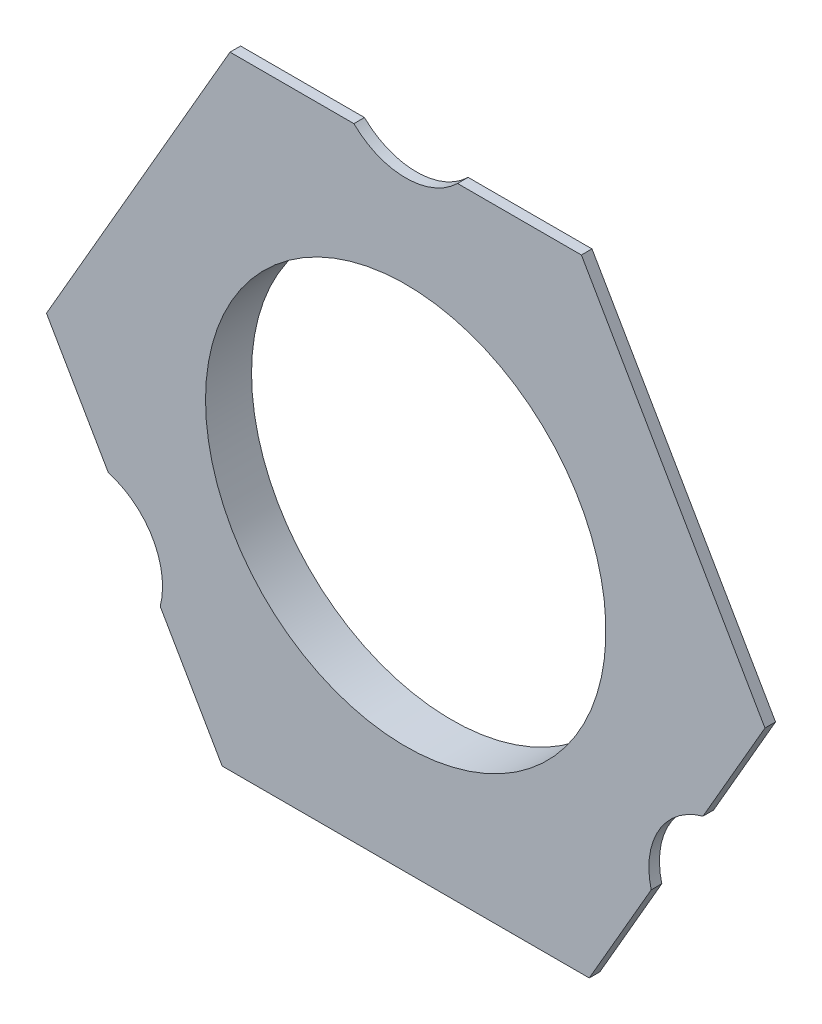
ISO-10303-21;
HEADER;
FILE_DESCRIPTION(('STEP AP214'),'2;1');
FILE_NAME('part.step','',(''),(''),'','','');
FILE_SCHEMA(('AUTOMOTIVE_DESIGN { 1 0 10303 214 1 1 1 1 }'));
ENDSEC;
DATA;
#1=APPLICATION_CONTEXT('core data for automotive mechanical design processes');
#2=APPLICATION_PROTOCOL_DEFINITION('international standard','automotive_design',2000,#1);
#3=PRODUCT_CONTEXT('',#1,'mechanical');
#4=PRODUCT('Part','Part','',(#3));
#5=PRODUCT_RELATED_PRODUCT_CATEGORY('part','',(#4));
#6=PRODUCT_DEFINITION_FORMATION('','',#4);
#7=PRODUCT_DEFINITION_CONTEXT('part definition',#1,'design');
#8=PRODUCT_DEFINITION('design','',#6,#7);
#9=PRODUCT_DEFINITION_SHAPE('','',#8);
#10=(LENGTH_UNIT() NAMED_UNIT(*) SI_UNIT(.MILLI.,.METRE.));
#11=(NAMED_UNIT(*) PLANE_ANGLE_UNIT() SI_UNIT($,.RADIAN.));
#12=(NAMED_UNIT(*) SI_UNIT($,.STERADIAN.) SOLID_ANGLE_UNIT());
#13=UNCERTAINTY_MEASURE_WITH_UNIT(LENGTH_MEASURE(1.E-05),#10,'distance_accuracy_value','');
#14=(GEOMETRIC_REPRESENTATION_CONTEXT(3) GLOBAL_UNCERTAINTY_ASSIGNED_CONTEXT((#13)) GLOBAL_UNIT_ASSIGNED_CONTEXT((#10,
#11,#12)) REPRESENTATION_CONTEXT('',''));
#15=CARTESIAN_POINT('',(0.,0.,0.));
#16=DIRECTION('',(0.,0.,1.));
#17=DIRECTION('',(1.,0.,0.));
#18=AXIS2_PLACEMENT_3D('',#15,#16,#17);
#19=CARTESIAN_POINT('',(39.85,0.,0.));
#20=DIRECTION('',(0.,0.,1.));
#21=DIRECTION('',(1.,0.,0.));
#22=AXIS2_PLACEMENT_3D('',#19,#20,#21);
#23=PLANE('',#22);
#24=CARTESIAN_POINT('',(0.,0.,0.));
#25=DIRECTION('',(0.,0.,1.));
#26=DIRECTION('',(1.,0.,0.));
#27=AXIS2_PLACEMENT_3D('',#24,#25,#26);
#28=CIRCLE('',#27,39.6);
#29=CARTESIAN_POINT('',(39.6,0.,0.));
#30=VERTEX_POINT('',#29);
#31=EDGE_CURVE('E44',#30,#30,#28,.F.);
#32=ORIENTED_EDGE('',*,*,#31,.T.);
#33=EDGE_LOOP('',(#32));
#34=FACE_BOUND('',#33,.T.);
#35=CARTESIAN_POINT('',(0.,0.,0.));
#36=DIRECTION('',(0.,0.,-1.));
#37=DIRECTION('',(-1.,0.,0.));
#38=AXIS2_PLACEMENT_3D('',#35,#36,#37);
#39=CIRCLE('',#38,37.85);
#40=CARTESIAN_POINT('',(-37.85,0.,0.));
#41=VERTEX_POINT('',#40);
#42=EDGE_CURVE('E211',#41,#41,#39,.T.);
#43=ORIENTED_EDGE('',*,*,#42,.F.);
#44=EDGE_LOOP('',(#43));
#45=FACE_BOUND('',#44,.T.);
#46=ADVANCED_FACE('F35',(#34,#45),#23,.F.);
#47=CARTESIAN_POINT('',(0.,0.,-73.9813673678491));
#48=DIRECTION('',(0.,0.,-1.));
#49=DIRECTION('',(-1.,0.,0.));
#50=AXIS2_PLACEMENT_3D('',#47,#48,#49);
#51=CYLINDRICAL_SURFACE('',#50,37.85);
#52=CARTESIAN_POINT('',(0.,0.,8.7));
#53=DIRECTION('',(0.,0.,-1.));
#54=DIRECTION('',(-1.,0.,0.));
#55=AXIS2_PLACEMENT_3D('',#52,#53,#54);
#56=CIRCLE('',#55,37.85);
#57=CARTESIAN_POINT('',(-37.85,0.,8.7));
#58=VERTEX_POINT('',#57);
#59=EDGE_CURVE('E161',#58,#58,#56,.F.);
#60=ORIENTED_EDGE('',*,*,#59,.T.);
#61=EDGE_LOOP('',(#60));
#62=FACE_BOUND('',#61,.T.);
#63=ORIENTED_EDGE('',*,*,#42,.T.);
#64=EDGE_LOOP('',(#63));
#65=FACE_BOUND('',#64,.T.);
#66=ADVANCED_FACE('F229',(#62,#65),#51,.F.);
#67=CARTESIAN_POINT('',(44.5,0.,8.7));
#68=DIRECTION('',(0.,0.,-1.));
#69=DIRECTION('',(-1.,0.,0.));
#70=AXIS2_PLACEMENT_3D('',#67,#68,#69);
#71=PLANE('',#70);
#72=DIRECTION('',(-0.5,0.866025403784439,0.));
#73=VECTOR('',#72,1.);
#74=CARTESIAN_POINT('',(67.9209846597947,-0.857403669130516,8.7));
#75=LINE('',#74,#73);
#76=CARTESIAN_POINT('',(67.9209846597947,-0.857403669130516,8.7));
#77=VERTEX_POINT('',#76);
#78=CARTESIAN_POINT('',(33.2179589711327,59.25,8.7));
#79=VERTEX_POINT('',#78);
#80=EDGE_CURVE('E93',#77,#79,#75,.T.);
#81=ORIENTED_EDGE('',*,*,#80,.T.);
#82=DIRECTION('',(-1.,0.,0.));
#83=VECTOR('',#82,1.);
#84=CARTESIAN_POINT('',(9.79795897113271,59.25,8.7));
#85=LINE('',#84,#83);
#86=CARTESIAN_POINT('',(9.79795897113271,59.25,8.7));
#87=VERTEX_POINT('',#86);
#88=EDGE_CURVE('E184',#79,#87,#85,.T.);
#89=ORIENTED_EDGE('',*,*,#88,.T.);
#90=CARTESIAN_POINT('',(0.,69.25,8.7));
#91=DIRECTION('',(0.,0.,-1.));
#92=DIRECTION('',(1.,0.,0.));
#93=AXIS2_PLACEMENT_3D('',#90,#91,#92);
#94=CIRCLE('',#93,14.);
#95=CARTESIAN_POINT('',(-9.79795897113271,59.25,8.7));
#96=VERTEX_POINT('',#95);
#97=EDGE_CURVE('E99',#87,#96,#94,.T.);
#98=ORIENTED_EDGE('',*,*,#97,.T.);
#99=DIRECTION('',(-1.,0.,0.));
#100=VECTOR('',#99,1.);
#101=CARTESIAN_POINT('',(-9.79795897113271,59.25,8.7));
#102=LINE('',#101,#100);
#103=CARTESIAN_POINT('',(-33.2179589711327,59.25,8.7));
#104=VERTEX_POINT('',#103);
#105=EDGE_CURVE('E160',#96,#104,#102,.T.);
#106=ORIENTED_EDGE('',*,*,#105,.T.);
#107=DIRECTION('',(-0.5,-0.866025403784439,0.));
#108=VECTOR('',#107,1.);
#109=CARTESIAN_POINT('',(-33.2179589711327,59.25,8.7));
#110=LINE('',#109,#108);
#111=CARTESIAN_POINT('',(-67.9209846597947,-0.857403669130529,8.7));
#112=VERTEX_POINT('',#111);
#113=EDGE_CURVE('E164',#104,#112,#110,.T.);
#114=ORIENTED_EDGE('',*,*,#113,.T.);
#115=DIRECTION('',(0.499999999999999,-0.866025403784439,0.));
#116=VECTOR('',#115,1.);
#117=CARTESIAN_POINT('',(-56.2109846597947,-21.1397186257621,8.7));
#118=LINE('',#117,#116);
#119=CARTESIAN_POINT('',(-56.2109846597947,-21.1397186257621,8.7));
#120=VERTEX_POINT('',#119);
#121=EDGE_CURVE('E166',#112,#120,#118,.T.);
#122=ORIENTED_EDGE('',*,*,#121,.T.);
#123=CARTESIAN_POINT('',(-59.9722592120727,-34.6250000000007,8.7));
#124=DIRECTION('',(0.,0.,-1.));
#125=DIRECTION('',(1.,0.,0.));
#126=AXIS2_PLACEMENT_3D('',#123,#124,#125);
#127=CIRCLE('',#126,14.);
#128=CARTESIAN_POINT('',(-46.413025688662,-38.1102813742392,8.7));
#129=VERTEX_POINT('',#128);
#130=EDGE_CURVE('E168',#120,#129,#127,.T.);
#131=ORIENTED_EDGE('',*,*,#130,.T.);
#132=DIRECTION('',(0.5,-0.866025403784438,0.));
#133=VECTOR('',#132,1.);
#134=CARTESIAN_POINT('',(-46.413025688662,-38.1102813742392,8.7));
#135=LINE('',#134,#133);
#136=CARTESIAN_POINT('',(-34.703025688662,-58.3925963308708,8.7));
#137=VERTEX_POINT('',#136);
#138=EDGE_CURVE('E170',#129,#137,#135,.T.);
#139=ORIENTED_EDGE('',*,*,#138,.T.);
#140=DIRECTION('',(1.,0.,0.));
#141=VECTOR('',#140,1.);
#142=CARTESIAN_POINT('',(-34.703025688662,-58.3925963308708,8.7));
#143=LINE('',#142,#141);
#144=CARTESIAN_POINT('',(34.703025688662,-58.3925963308708,8.7));
#145=VERTEX_POINT('',#144);
#146=EDGE_CURVE('E173',#137,#145,#143,.T.);
#147=ORIENTED_EDGE('',*,*,#146,.T.);
#148=DIRECTION('',(0.5,0.866025403784439,0.));
#149=VECTOR('',#148,1.);
#150=CARTESIAN_POINT('',(46.413025688662,-38.1102813742392,8.7));
#151=LINE('',#150,#149);
#152=CARTESIAN_POINT('',(46.413025688662,-38.1102813742392,8.7));
#153=VERTEX_POINT('',#152);
#154=EDGE_CURVE('E176',#145,#153,#151,.T.);
#155=ORIENTED_EDGE('',*,*,#154,.T.);
#156=CARTESIAN_POINT('',(59.9722592120728,-34.6250000000006,8.7));
#157=DIRECTION('',(0.,0.,-1.));
#158=DIRECTION('',(1.,0.,0.));
#159=AXIS2_PLACEMENT_3D('',#156,#157,#158);
#160=CIRCLE('',#159,14.);
#161=CARTESIAN_POINT('',(56.2109846597947,-21.1397186257621,8.7));
#162=VERTEX_POINT('',#161);
#163=EDGE_CURVE('E179',#153,#162,#160,.T.);
#164=ORIENTED_EDGE('',*,*,#163,.T.);
#165=DIRECTION('',(0.5,0.866025403784439,0.));
#166=VECTOR('',#165,1.);
#167=CARTESIAN_POINT('',(56.2109846597947,-21.1397186257621,8.7));
#168=LINE('',#167,#166);
#169=EDGE_CURVE('E181',#162,#77,#168,.T.);
#170=ORIENTED_EDGE('',*,*,#169,.T.);
#171=EDGE_LOOP('',(#81,#89,#98,#106,#114,#122,#131,#139,#147,#155,#164,#170));
#172=FACE_BOUND('',#171,.T.);
#173=ORIENTED_EDGE('',*,*,#59,.F.);
#174=EDGE_LOOP('',(#173));
#175=FACE_BOUND('',#174,.T.);
#176=ADVANCED_FACE('F233',(#172,#175),#71,.F.);
#177=CARTESIAN_POINT('',(55.25,0.,6.70000000000001));
#178=DIRECTION('',(0.,0.,1.));
#179=DIRECTION('',(1.,0.,0.));
#180=AXIS2_PLACEMENT_3D('',#177,#178,#179);
#181=PLANE('',#180);
#182=CARTESIAN_POINT('',(-59.9722592120727,-34.6250000000007,6.7));
#183=DIRECTION('',(0.,0.,-1.));
#184=DIRECTION('',(1.,0.,0.));
#185=AXIS2_PLACEMENT_3D('',#182,#183,#184);
#186=CIRCLE('',#185,14.);
#187=CARTESIAN_POINT('',(-56.2109846597947,-21.1397186257621,6.7));
#188=VERTEX_POINT('',#187);
#189=CARTESIAN_POINT('',(-46.413025688662,-38.1102813742392,6.7));
#190=VERTEX_POINT('',#189);
#191=EDGE_CURVE('E300',#188,#190,#186,.T.);
#192=ORIENTED_EDGE('',*,*,#191,.F.);
#193=DIRECTION('',(0.499999999999999,-0.866025403784439,0.));
#194=VECTOR('',#193,1.);
#195=CARTESIAN_POINT('',(-56.2109846597947,-21.1397186257621,6.7));
#196=LINE('',#195,#194);
#197=CARTESIAN_POINT('',(-67.9209846597947,-0.857403669130529,6.7));
#198=VERTEX_POINT('',#197);
#199=EDGE_CURVE('E297',#198,#188,#196,.T.);
#200=ORIENTED_EDGE('',*,*,#199,.F.);
#201=DIRECTION('',(-0.5,-0.866025403784439,0.));
#202=VECTOR('',#201,1.);
#203=CARTESIAN_POINT('',(-33.2179589711327,59.25,6.7));
#204=LINE('',#203,#202);
#205=CARTESIAN_POINT('',(-33.2179589711327,59.25,6.7));
#206=VERTEX_POINT('',#205);
#207=EDGE_CURVE('E318',#206,#198,#204,.T.);
#208=ORIENTED_EDGE('',*,*,#207,.F.);
#209=DIRECTION('',(-1.,0.,0.));
#210=VECTOR('',#209,1.);
#211=CARTESIAN_POINT('',(-9.79795897113271,59.25,6.7));
#212=LINE('',#211,#210);
#213=CARTESIAN_POINT('',(-9.79795897113271,59.25,6.7));
#214=VERTEX_POINT('',#213);
#215=EDGE_CURVE('E289',#214,#206,#212,.T.);
#216=ORIENTED_EDGE('',*,*,#215,.F.);
#217=CARTESIAN_POINT('',(0.,69.25,6.7));
#218=DIRECTION('',(0.,0.,-1.));
#219=DIRECTION('',(1.,0.,0.));
#220=AXIS2_PLACEMENT_3D('',#217,#218,#219);
#221=CIRCLE('',#220,14.);
#222=CARTESIAN_POINT('',(9.79795897113271,59.25,6.7));
#223=VERTEX_POINT('',#222);
#224=EDGE_CURVE('E52',#223,#214,#221,.T.);
#225=ORIENTED_EDGE('',*,*,#224,.F.);
#226=DIRECTION('',(-1.,0.,0.));
#227=VECTOR('',#226,1.);
#228=CARTESIAN_POINT('',(9.79795897113271,59.25,6.7));
#229=LINE('',#228,#227);
#230=CARTESIAN_POINT('',(33.2179589711327,59.25,6.7));
#231=VERTEX_POINT('',#230);
#232=EDGE_CURVE('E146',#231,#223,#229,.T.);
#233=ORIENTED_EDGE('',*,*,#232,.F.);
#234=DIRECTION('',(-0.5,0.866025403784439,0.));
#235=VECTOR('',#234,1.);
#236=CARTESIAN_POINT('',(67.9209846597947,-0.857403669130516,6.7));
#237=LINE('',#236,#235);
#238=CARTESIAN_POINT('',(67.9209846597947,-0.857403669130516,6.7));
#239=VERTEX_POINT('',#238);
#240=EDGE_CURVE('E134',#239,#231,#237,.T.);
#241=ORIENTED_EDGE('',*,*,#240,.F.);
#242=DIRECTION('',(0.5,0.866025403784439,0.));
#243=VECTOR('',#242,1.);
#244=CARTESIAN_POINT('',(56.2109846597947,-21.1397186257621,6.7));
#245=LINE('',#244,#243);
#246=CARTESIAN_POINT('',(56.2109846597947,-21.1397186257621,6.7));
#247=VERTEX_POINT('',#246);
#248=EDGE_CURVE('E144',#247,#239,#245,.T.);
#249=ORIENTED_EDGE('',*,*,#248,.F.);
#250=CARTESIAN_POINT('',(59.9722592120728,-34.6250000000006,6.7));
#251=DIRECTION('',(0.,0.,-1.));
#252=DIRECTION('',(1.,0.,0.));
#253=AXIS2_PLACEMENT_3D('',#250,#251,#252);
#254=CIRCLE('',#253,14.);
#255=CARTESIAN_POINT('',(46.413025688662,-38.1102813742392,6.7));
#256=VERTEX_POINT('',#255);
#257=EDGE_CURVE('E151',#256,#247,#254,.T.);
#258=ORIENTED_EDGE('',*,*,#257,.F.);
#259=DIRECTION('',(0.5,0.866025403784439,0.));
#260=VECTOR('',#259,1.);
#261=CARTESIAN_POINT('',(46.413025688662,-38.1102813742392,6.7));
#262=LINE('',#261,#260);
#263=CARTESIAN_POINT('',(34.703025688662,-58.3925963308708,6.7));
#264=VERTEX_POINT('',#263);
#265=EDGE_CURVE('E153',#264,#256,#262,.T.);
#266=ORIENTED_EDGE('',*,*,#265,.F.);
#267=DIRECTION('',(1.,0.,0.));
#268=VECTOR('',#267,1.);
#269=CARTESIAN_POINT('',(-34.703025688662,-58.3925963308708,6.7));
#270=LINE('',#269,#268);
#271=CARTESIAN_POINT('',(-34.703025688662,-58.3925963308708,6.7));
#272=VERTEX_POINT('',#271);
#273=EDGE_CURVE('E307',#272,#264,#270,.T.);
#274=ORIENTED_EDGE('',*,*,#273,.F.);
#275=DIRECTION('',(0.5,-0.866025403784438,0.));
#276=VECTOR('',#275,1.);
#277=CARTESIAN_POINT('',(-46.413025688662,-38.1102813742392,6.7));
#278=LINE('',#277,#276);
#279=EDGE_CURVE('E312',#190,#272,#278,.T.);
#280=ORIENTED_EDGE('',*,*,#279,.F.);
#281=EDGE_LOOP('',(#192,#200,#208,#216,#225,#233,#241,#249,#258,#266,#274,#280));
#282=FACE_BOUND('',#281,.T.);
#283=CARTESIAN_POINT('',(0.,0.,6.7));
#284=DIRECTION('',(0.,0.,-1.));
#285=DIRECTION('',(-1.,0.,0.));
#286=AXIS2_PLACEMENT_3D('',#283,#284,#285);
#287=CIRCLE('',#286,39.85);
#288=CARTESIAN_POINT('',(-39.85,0.,6.7));
#289=VERTEX_POINT('',#288);
#290=EDGE_CURVE('E188',#289,#289,#287,.T.);
#291=ORIENTED_EDGE('',*,*,#290,.F.);
#292=EDGE_LOOP('',(#291));
#293=FACE_BOUND('',#292,.T.);
#294=ADVANCED_FACE('F142',(#282,#293),#181,.F.);
#295=CARTESIAN_POINT('',(0.,0.,-73.9813673678491));
#296=DIRECTION('',(0.,0.,-1.));
#297=DIRECTION('',(-1.,0.,0.));
#298=AXIS2_PLACEMENT_3D('',#295,#296,#297);
#299=CYLINDRICAL_SURFACE('',#298,39.85);
#300=CARTESIAN_POINT('',(0.,0.,0.250000000000014));
#301=DIRECTION('',(0.,0.,1.));
#302=DIRECTION('',(1.,0.,0.));
#303=AXIS2_PLACEMENT_3D('',#300,#301,#302);
#304=CIRCLE('',#303,39.85);
#305=CARTESIAN_POINT('',(39.85,0.,0.250000000000014));
#306=VERTEX_POINT('',#305);
#307=EDGE_CURVE('E11',#306,#306,#304,.T.);
#308=ORIENTED_EDGE('',*,*,#307,.T.);
#309=EDGE_LOOP('',(#308));
#310=FACE_BOUND('',#309,.T.);
#311=ORIENTED_EDGE('',*,*,#290,.T.);
#312=EDGE_LOOP('',(#311));
#313=FACE_BOUND('',#312,.T.);
#314=ADVANCED_FACE('F241',(#310,#313),#299,.T.);
#315=CARTESIAN_POINT('',(0.,69.25,6.7));
#316=DIRECTION('',(0.,0.,1.));
#317=DIRECTION('',(1.,0.,0.));
#318=AXIS2_PLACEMENT_3D('',#315,#316,#317);
#319=CYLINDRICAL_SURFACE('',#318,14.);
#320=ORIENTED_EDGE('',*,*,#97,.F.);
#321=DIRECTION('',(0.,0.,1.));
#322=VECTOR('',#321,1.);
#323=CARTESIAN_POINT('',(9.79795897113271,59.25,6.7));
#324=LINE('',#323,#322);
#325=EDGE_CURVE('E186',#223,#87,#324,.T.);
#326=ORIENTED_EDGE('',*,*,#325,.F.);
#327=ORIENTED_EDGE('',*,*,#224,.T.);
#328=DIRECTION('',(0.,0.,1.));
#329=VECTOR('',#328,1.);
#330=CARTESIAN_POINT('',(-9.79795897113271,59.25,6.7));
#331=LINE('',#330,#329);
#332=EDGE_CURVE('E158',#214,#96,#331,.T.);
#333=ORIENTED_EDGE('',*,*,#332,.T.);
#334=EDGE_LOOP('',(#320,#326,#327,#333));
#335=FACE_BOUND('',#334,.T.);
#336=ADVANCED_FACE('F244',(#335),#319,.F.);
#337=CARTESIAN_POINT('',(59.9722592120728,-34.6250000000006,6.7));
#338=DIRECTION('',(0.,0.,1.));
#339=DIRECTION('',(1.,0.,0.));
#340=AXIS2_PLACEMENT_3D('',#337,#338,#339);
#341=CYLINDRICAL_SURFACE('',#340,14.);
#342=DIRECTION('',(0.,0.,1.));
#343=VECTOR('',#342,1.);
#344=CARTESIAN_POINT('',(56.2109846597947,-21.1397186257621,6.7));
#345=LINE('',#344,#343);
#346=EDGE_CURVE('E139',#247,#162,#345,.T.);
#347=ORIENTED_EDGE('',*,*,#346,.T.);
#348=ORIENTED_EDGE('',*,*,#163,.F.);
#349=DIRECTION('',(0.,0.,1.));
#350=VECTOR('',#349,1.);
#351=CARTESIAN_POINT('',(46.413025688662,-38.1102813742392,6.7));
#352=LINE('',#351,#350);
#353=EDGE_CURVE('E191',#256,#153,#352,.T.);
#354=ORIENTED_EDGE('',*,*,#353,.F.);
#355=ORIENTED_EDGE('',*,*,#257,.T.);
#356=EDGE_LOOP('',(#347,#348,#354,#355));
#357=FACE_BOUND('',#356,.T.);
#358=ADVANCED_FACE('F247',(#357),#341,.F.);
#359=CARTESIAN_POINT('',(-59.9722592120727,-34.6250000000007,6.7));
#360=DIRECTION('',(0.,0.,1.));
#361=DIRECTION('',(1.,0.,0.));
#362=AXIS2_PLACEMENT_3D('',#359,#360,#361);
#363=CYLINDRICAL_SURFACE('',#362,14.);
#364=DIRECTION('',(0.,0.,1.));
#365=VECTOR('',#364,1.);
#366=CARTESIAN_POINT('',(-46.413025688662,-38.1102813742392,6.7));
#367=LINE('',#366,#365);
#368=EDGE_CURVE('E197',#190,#129,#367,.T.);
#369=ORIENTED_EDGE('',*,*,#368,.T.);
#370=ORIENTED_EDGE('',*,*,#130,.F.);
#371=DIRECTION('',(0.,0.,1.));
#372=VECTOR('',#371,1.);
#373=CARTESIAN_POINT('',(-56.2109846597947,-21.1397186257621,6.7));
#374=LINE('',#373,#372);
#375=EDGE_CURVE('E200',#188,#120,#374,.T.);
#376=ORIENTED_EDGE('',*,*,#375,.F.);
#377=ORIENTED_EDGE('',*,*,#191,.T.);
#378=EDGE_LOOP('',(#369,#370,#376,#377));
#379=FACE_BOUND('',#378,.T.);
#380=ADVANCED_FACE('F257',(#379),#363,.F.);
#381=CARTESIAN_POINT('',(9.79795897113271,59.25,6.7));
#382=DIRECTION('',(0.,1.,0.));
#383=DIRECTION('',(0.,0.,1.));
#384=AXIS2_PLACEMENT_3D('',#381,#382,#383);
#385=PLANE('',#384);
#386=ORIENTED_EDGE('',*,*,#88,.F.);
#387=DIRECTION('',(0.,0.,1.));
#388=VECTOR('',#387,1.);
#389=CARTESIAN_POINT('',(33.2179589711327,59.25,6.7));
#390=LINE('',#389,#388);
#391=EDGE_CURVE('E138',#231,#79,#390,.T.);
#392=ORIENTED_EDGE('',*,*,#391,.F.);
#393=ORIENTED_EDGE('',*,*,#232,.T.);
#394=ORIENTED_EDGE('',*,*,#325,.T.);
#395=EDGE_LOOP('',(#386,#392,#393,#394));
#396=FACE_BOUND('',#395,.T.);
#397=ADVANCED_FACE('F260',(#396),#385,.T.);
#398=CARTESIAN_POINT('',(67.9209846597947,-0.857403669130516,6.7));
#399=DIRECTION('',(0.866025403784439,0.5,0.));
#400=DIRECTION('',(-0.5,0.866025403784439,0.));
#401=AXIS2_PLACEMENT_3D('',#398,#399,#400);
#402=PLANE('',#401);
#403=ORIENTED_EDGE('',*,*,#80,.F.);
#404=DIRECTION('',(0.,0.,1.));
#405=VECTOR('',#404,1.);
#406=CARTESIAN_POINT('',(67.9209846597947,-0.857403669130516,6.7));
#407=LINE('',#406,#405);
#408=EDGE_CURVE('E131',#239,#77,#407,.T.);
#409=ORIENTED_EDGE('',*,*,#408,.F.);
#410=ORIENTED_EDGE('',*,*,#240,.T.);
#411=ORIENTED_EDGE('',*,*,#391,.T.);
#412=EDGE_LOOP('',(#403,#409,#410,#411));
#413=FACE_BOUND('',#412,.T.);
#414=ADVANCED_FACE('F133',(#413),#402,.T.);
#415=CARTESIAN_POINT('',(56.2109846597947,-21.1397186257621,6.7));
#416=DIRECTION('',(0.866025403784439,-0.5,0.));
#417=DIRECTION('',(0.5,0.866025403784439,0.));
#418=AXIS2_PLACEMENT_3D('',#415,#416,#417);
#419=PLANE('',#418);
#420=ORIENTED_EDGE('',*,*,#169,.F.);
#421=ORIENTED_EDGE('',*,*,#346,.F.);
#422=ORIENTED_EDGE('',*,*,#248,.T.);
#423=ORIENTED_EDGE('',*,*,#408,.T.);
#424=EDGE_LOOP('',(#420,#421,#422,#423));
#425=FACE_BOUND('',#424,.T.);
#426=ADVANCED_FACE('F149',(#425),#419,.T.);
#427=CARTESIAN_POINT('',(46.413025688662,-38.1102813742392,6.7));
#428=DIRECTION('',(0.866025403784439,-0.5,0.));
#429=DIRECTION('',(0.5,0.866025403784439,0.));
#430=AXIS2_PLACEMENT_3D('',#427,#428,#429);
#431=PLANE('',#430);
#432=ORIENTED_EDGE('',*,*,#154,.F.);
#433=DIRECTION('',(0.,0.,1.));
#434=VECTOR('',#433,1.);
#435=CARTESIAN_POINT('',(34.703025688662,-58.3925963308708,6.7));
#436=LINE('',#435,#434);
#437=EDGE_CURVE('E193',#264,#145,#436,.T.);
#438=ORIENTED_EDGE('',*,*,#437,.F.);
#439=ORIENTED_EDGE('',*,*,#265,.T.);
#440=ORIENTED_EDGE('',*,*,#353,.T.);
#441=EDGE_LOOP('',(#432,#438,#439,#440));
#442=FACE_BOUND('',#441,.T.);
#443=ADVANCED_FACE('F268',(#442),#431,.T.);
#444=CARTESIAN_POINT('',(-34.703025688662,-58.3925963308708,6.7));
#445=DIRECTION('',(0.,-1.,0.));
#446=DIRECTION('',(1.,0.,0.));
#447=AXIS2_PLACEMENT_3D('',#444,#445,#446);
#448=PLANE('',#447);
#449=ORIENTED_EDGE('',*,*,#146,.F.);
#450=DIRECTION('',(0.,0.,1.));
#451=VECTOR('',#450,1.);
#452=CARTESIAN_POINT('',(-34.703025688662,-58.3925963308708,6.7));
#453=LINE('',#452,#451);
#454=EDGE_CURVE('E195',#272,#137,#453,.T.);
#455=ORIENTED_EDGE('',*,*,#454,.F.);
#456=ORIENTED_EDGE('',*,*,#273,.T.);
#457=ORIENTED_EDGE('',*,*,#437,.T.);
#458=EDGE_LOOP('',(#449,#455,#456,#457));
#459=FACE_BOUND('',#458,.T.);
#460=ADVANCED_FACE('F264',(#459),#448,.T.);
#461=CARTESIAN_POINT('',(-46.413025688662,-38.1102813742392,6.7));
#462=DIRECTION('',(-0.866025403784438,-0.5,0.));
#463=DIRECTION('',(0.5,-0.866025403784438,0.));
#464=AXIS2_PLACEMENT_3D('',#461,#462,#463);
#465=PLANE('',#464);
#466=ORIENTED_EDGE('',*,*,#138,.F.);
#467=ORIENTED_EDGE('',*,*,#368,.F.);
#468=ORIENTED_EDGE('',*,*,#279,.T.);
#469=ORIENTED_EDGE('',*,*,#454,.T.);
#470=EDGE_LOOP('',(#466,#467,#468,#469));
#471=FACE_BOUND('',#470,.T.);
#472=ADVANCED_FACE('F255',(#471),#465,.T.);
#473=CARTESIAN_POINT('',(-56.2109846597947,-21.1397186257621,6.7));
#474=DIRECTION('',(-0.866025403784439,-0.499999999999999,0.));
#475=DIRECTION('',(0.499999999999999,-0.866025403784439,0.));
#476=AXIS2_PLACEMENT_3D('',#473,#474,#475);
#477=PLANE('',#476);
#478=ORIENTED_EDGE('',*,*,#121,.F.);
#479=DIRECTION('',(0.,0.,1.));
#480=VECTOR('',#479,1.);
#481=CARTESIAN_POINT('',(-67.9209846597947,-0.857403669130529,6.7));
#482=LINE('',#481,#480);
#483=EDGE_CURVE('E203',#198,#112,#482,.T.);
#484=ORIENTED_EDGE('',*,*,#483,.F.);
#485=ORIENTED_EDGE('',*,*,#199,.T.);
#486=ORIENTED_EDGE('',*,*,#375,.T.);
#487=EDGE_LOOP('',(#478,#484,#485,#486));
#488=FACE_BOUND('',#487,.T.);
#489=ADVANCED_FACE('F251',(#488),#477,.T.);
#490=CARTESIAN_POINT('',(-33.2179589711327,59.25,6.7));
#491=DIRECTION('',(-0.866025403784439,0.5,0.));
#492=DIRECTION('',(-0.5,-0.866025403784439,0.));
#493=AXIS2_PLACEMENT_3D('',#490,#491,#492);
#494=PLANE('',#493);
#495=ORIENTED_EDGE('',*,*,#113,.F.);
#496=DIRECTION('',(0.,0.,1.));
#497=VECTOR('',#496,1.);
#498=CARTESIAN_POINT('',(-33.2179589711327,59.25,6.7));
#499=LINE('',#498,#497);
#500=EDGE_CURVE('E206',#206,#104,#499,.T.);
#501=ORIENTED_EDGE('',*,*,#500,.F.);
#502=ORIENTED_EDGE('',*,*,#207,.T.);
#503=ORIENTED_EDGE('',*,*,#483,.T.);
#504=EDGE_LOOP('',(#495,#501,#502,#503));
#505=FACE_BOUND('',#504,.T.);
#506=ADVANCED_FACE('F224',(#505),#494,.T.);
#507=CARTESIAN_POINT('',(-9.79795897113271,59.25,6.7));
#508=DIRECTION('',(0.,1.,0.));
#509=DIRECTION('',(0.,0.,1.));
#510=AXIS2_PLACEMENT_3D('',#507,#508,#509);
#511=PLANE('',#510);
#512=ORIENTED_EDGE('',*,*,#105,.F.);
#513=ORIENTED_EDGE('',*,*,#332,.F.);
#514=ORIENTED_EDGE('',*,*,#215,.T.);
#515=ORIENTED_EDGE('',*,*,#500,.T.);
#516=EDGE_LOOP('',(#512,#513,#514,#515));
#517=FACE_BOUND('',#516,.T.);
#518=ADVANCED_FACE('F219',(#517),#511,.T.);
#519=CARTESIAN_POINT('',(0.,0.,0.));
#520=DIRECTION('',(0.,0.,1.));
#521=DIRECTION('',(1.,0.,0.));
#522=AXIS2_PLACEMENT_3D('',#519,#520,#521);
#523=CONICAL_SURFACE('',#522,39.6,0.785398163397435);
#524=ORIENTED_EDGE('',*,*,#307,.F.);
#525=EDGE_LOOP('',(#524));
#526=FACE_BOUND('',#525,.T.);
#527=ORIENTED_EDGE('',*,*,#31,.F.);
#528=EDGE_LOOP('',(#527));
#529=FACE_BOUND('',#528,.T.);
#530=ADVANCED_FACE('F37',(#526,#529),#523,.T.);
#531=CLOSED_SHELL('',(#46,#66,#176,#294,#314,#336,#358,#380,#397,#414,#426,#443,#460,#472,#489,
#506,#518,#530));
#532=MANIFOLD_SOLID_BREP('B2',#531);
#533=ADVANCED_BREP_SHAPE_REPRESENTATION('',(#18,#532),#14);
#534=SHAPE_DEFINITION_REPRESENTATION(#9,#533);
ENDSEC;
END-ISO-10303-21;
